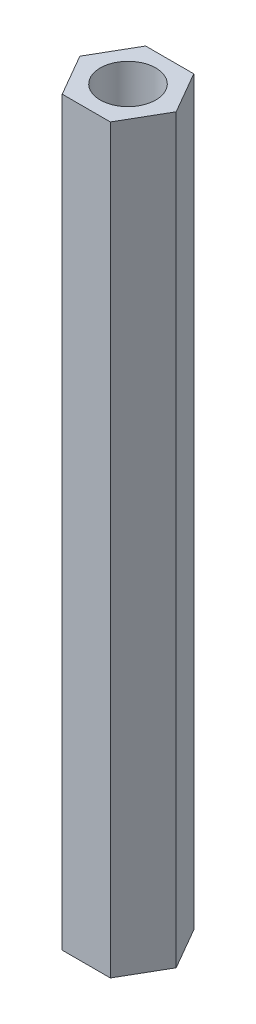
ISO-10303-21;
HEADER;
FILE_DESCRIPTION(('STEP AP214'),'2;1');
FILE_NAME('part.step','',(''),(''),'','','');
FILE_SCHEMA(('AUTOMOTIVE_DESIGN { 1 0 10303 214 1 1 1 1 }'));
ENDSEC;
DATA;
#1=APPLICATION_CONTEXT('core data for automotive mechanical design processes');
#2=APPLICATION_PROTOCOL_DEFINITION('international standard','automotive_design',2000,#1);
#3=PRODUCT_CONTEXT('',#1,'mechanical');
#4=PRODUCT('Part','Part','',(#3));
#5=PRODUCT_RELATED_PRODUCT_CATEGORY('part','',(#4));
#6=PRODUCT_DEFINITION_FORMATION('','',#4);
#7=PRODUCT_DEFINITION_CONTEXT('part definition',#1,'design');
#8=PRODUCT_DEFINITION('design','',#6,#7);
#9=PRODUCT_DEFINITION_SHAPE('','',#8);
#10=(LENGTH_UNIT() NAMED_UNIT(*) SI_UNIT(.MILLI.,.METRE.));
#11=(NAMED_UNIT(*) PLANE_ANGLE_UNIT() SI_UNIT($,.RADIAN.));
#12=(NAMED_UNIT(*) SI_UNIT($,.STERADIAN.) SOLID_ANGLE_UNIT());
#13=UNCERTAINTY_MEASURE_WITH_UNIT(LENGTH_MEASURE(1.E-05),#10,'distance_accuracy_value','');
#14=(GEOMETRIC_REPRESENTATION_CONTEXT(3) GLOBAL_UNCERTAINTY_ASSIGNED_CONTEXT((#13)) GLOBAL_UNIT_ASSIGNED_CONTEXT((#10,
#11,#12)) REPRESENTATION_CONTEXT('',''));
#15=CARTESIAN_POINT('',(0.,0.,0.));
#16=DIRECTION('',(0.,0.,1.));
#17=DIRECTION('',(1.,0.,0.));
#18=AXIS2_PLACEMENT_3D('',#15,#16,#17);
#19=CARTESIAN_POINT('',(0.,40.,0.));
#20=DIRECTION('',(0.,1.,0.));
#21=DIRECTION('',(0.,0.,1.));
#22=AXIS2_PLACEMENT_3D('',#19,#20,#21);
#23=PLANE('',#22);
#24=DIRECTION('',(0.499999999999995,0.,-0.866025403784441));
#25=VECTOR('',#24,1.);
#26=CARTESIAN_POINT('',(1.29903810567669,40.,2.24999999999999));
#27=LINE('',#26,#25);
#28=CARTESIAN_POINT('',(1.29903810567669,40.,2.24999999999999));
#29=VERTEX_POINT('',#28);
#30=CARTESIAN_POINT('',(2.59807621135332,40.,0.));
#31=VERTEX_POINT('',#30);
#32=EDGE_CURVE('E146',#29,#31,#27,.T.);
#33=ORIENTED_EDGE('',*,*,#32,.T.);
#34=DIRECTION('',(-0.500000000000001,0.,-0.866025403784438));
#35=VECTOR('',#34,1.);
#36=CARTESIAN_POINT('',(2.59807621135332,40.,0.));
#37=LINE('',#36,#35);
#38=CARTESIAN_POINT('',(1.29903810567665,40.,-2.25));
#39=VERTEX_POINT('',#38);
#40=EDGE_CURVE('E94',#31,#39,#37,.T.);
#41=ORIENTED_EDGE('',*,*,#40,.T.);
#42=DIRECTION('',(-1.,0.,0.));
#43=VECTOR('',#42,1.);
#44=CARTESIAN_POINT('',(1.29903810567665,40.,-2.25));
#45=LINE('',#44,#43);
#46=CARTESIAN_POINT('',(-1.29903810567667,40.,-2.25));
#47=VERTEX_POINT('',#46);
#48=EDGE_CURVE('E107',#39,#47,#45,.T.);
#49=ORIENTED_EDGE('',*,*,#48,.T.);
#50=DIRECTION('',(-0.499999999999995,0.,0.866025403784442));
#51=VECTOR('',#50,1.);
#52=CARTESIAN_POINT('',(-1.29903810567667,40.,-2.25));
#53=LINE('',#52,#51);
#54=CARTESIAN_POINT('',(-2.59807621135332,40.,0.));
#55=VERTEX_POINT('',#54);
#56=EDGE_CURVE('E101',#47,#55,#53,.T.);
#57=ORIENTED_EDGE('',*,*,#56,.T.);
#58=DIRECTION('',(0.500000000000007,0.,0.866025403784435));
#59=VECTOR('',#58,1.);
#60=CARTESIAN_POINT('',(-2.59807621135332,40.,0.));
#61=LINE('',#60,#59);
#62=CARTESIAN_POINT('',(-1.29903810567664,40.,2.25000000000001));
#63=VERTEX_POINT('',#62);
#64=EDGE_CURVE('E105',#55,#63,#61,.T.);
#65=ORIENTED_EDGE('',*,*,#64,.T.);
#66=DIRECTION('',(1.,0.,0.));
#67=VECTOR('',#66,1.);
#68=CARTESIAN_POINT('',(-1.29903810567664,40.,2.25000000000001));
#69=LINE('',#68,#67);
#70=EDGE_CURVE('E57',#63,#29,#69,.T.);
#71=ORIENTED_EDGE('',*,*,#70,.T.);
#72=EDGE_LOOP('',(#33,#41,#49,#57,#65,#71));
#73=FACE_BOUND('',#72,.T.);
#74=CARTESIAN_POINT('',(0.,40.,0.));
#75=DIRECTION('',(0.,1.,0.));
#76=DIRECTION('',(0.,0.,1.));
#77=AXIS2_PLACEMENT_3D('',#74,#75,#76);
#78=CIRCLE('',#77,1.5);
#79=CARTESIAN_POINT('',(0.,40.,1.5));
#80=VERTEX_POINT('',#79);
#81=EDGE_CURVE('E134',#80,#80,#78,.T.);
#82=ORIENTED_EDGE('',*,*,#81,.F.);
#83=EDGE_LOOP('',(#82));
#84=FACE_BOUND('',#83,.T.);
#85=ADVANCED_FACE('F39',(#73,#84),#23,.T.);
#86=CARTESIAN_POINT('',(0.,0.,0.));
#87=DIRECTION('',(0.,1.,0.));
#88=DIRECTION('',(0.,0.,1.));
#89=AXIS2_PLACEMENT_3D('',#86,#87,#88);
#90=PLANE('',#89);
#91=DIRECTION('',(0.499999999999995,0.,-0.866025403784441));
#92=VECTOR('',#91,1.);
#93=CARTESIAN_POINT('',(1.29903810567669,0.,2.24999999999999));
#94=LINE('',#93,#92);
#95=CARTESIAN_POINT('',(1.29903810567669,0.,2.24999999999999));
#96=VERTEX_POINT('',#95);
#97=CARTESIAN_POINT('',(2.59807621135332,0.,0.));
#98=VERTEX_POINT('',#97);
#99=EDGE_CURVE('E129',#96,#98,#94,.T.);
#100=ORIENTED_EDGE('',*,*,#99,.F.);
#101=DIRECTION('',(1.,0.,0.));
#102=VECTOR('',#101,1.);
#103=CARTESIAN_POINT('',(-1.29903810567664,0.,2.25000000000001));
#104=LINE('',#103,#102);
#105=CARTESIAN_POINT('',(-1.29903810567664,0.,2.25000000000001));
#106=VERTEX_POINT('',#105);
#107=EDGE_CURVE('E86',#106,#96,#104,.T.);
#108=ORIENTED_EDGE('',*,*,#107,.F.);
#109=DIRECTION('',(0.500000000000007,0.,0.866025403784435));
#110=VECTOR('',#109,1.);
#111=CARTESIAN_POINT('',(-2.59807621135332,0.,0.));
#112=LINE('',#111,#110);
#113=CARTESIAN_POINT('',(-2.59807621135332,0.,0.));
#114=VERTEX_POINT('',#113);
#115=EDGE_CURVE('E80',#114,#106,#112,.T.);
#116=ORIENTED_EDGE('',*,*,#115,.F.);
#117=DIRECTION('',(-0.499999999999995,0.,0.866025403784442));
#118=VECTOR('',#117,1.);
#119=CARTESIAN_POINT('',(-1.29903810567667,0.,-2.25));
#120=LINE('',#119,#118);
#121=CARTESIAN_POINT('',(-1.29903810567667,0.,-2.25));
#122=VERTEX_POINT('',#121);
#123=EDGE_CURVE('E116',#122,#114,#120,.T.);
#124=ORIENTED_EDGE('',*,*,#123,.F.);
#125=DIRECTION('',(-1.,0.,0.));
#126=VECTOR('',#125,1.);
#127=CARTESIAN_POINT('',(1.29903810567665,0.,-2.25));
#128=LINE('',#127,#126);
#129=CARTESIAN_POINT('',(1.29903810567665,0.,-2.25));
#130=VERTEX_POINT('',#129);
#131=EDGE_CURVE('E137',#130,#122,#128,.T.);
#132=ORIENTED_EDGE('',*,*,#131,.F.);
#133=DIRECTION('',(-0.500000000000001,0.,-0.866025403784438));
#134=VECTOR('',#133,1.);
#135=CARTESIAN_POINT('',(2.59807621135332,0.,0.));
#136=LINE('',#135,#134);
#137=EDGE_CURVE('E133',#98,#130,#136,.T.);
#138=ORIENTED_EDGE('',*,*,#137,.F.);
#139=EDGE_LOOP('',(#100,#108,#116,#124,#132,#138));
#140=FACE_BOUND('',#139,.T.);
#141=CARTESIAN_POINT('',(0.,0.,0.));
#142=DIRECTION('',(0.,1.,0.));
#143=DIRECTION('',(0.,0.,1.));
#144=AXIS2_PLACEMENT_3D('',#141,#142,#143);
#145=CIRCLE('',#144,1.5);
#146=CARTESIAN_POINT('',(0.,0.,1.5));
#147=VERTEX_POINT('',#146);
#148=EDGE_CURVE('E243',#147,#147,#145,.T.);
#149=ORIENTED_EDGE('',*,*,#148,.T.);
#150=EDGE_LOOP('',(#149));
#151=FACE_BOUND('',#150,.T.);
#152=ADVANCED_FACE('F159',(#140,#151),#90,.F.);
#153=CARTESIAN_POINT('',(1.29903810567669,40.,2.24999999999999));
#154=DIRECTION('',(-0.866025403784442,0.,-0.499999999999995));
#155=DIRECTION('',(-0.499999999999995,0.,0.866025403784442));
#156=AXIS2_PLACEMENT_3D('',#153,#154,#155);
#157=PLANE('',#156);
#158=ORIENTED_EDGE('',*,*,#99,.T.);
#159=DIRECTION('',(0.,-1.,0.));
#160=VECTOR('',#159,1.);
#161=CARTESIAN_POINT('',(2.59807621135332,40.,0.));
#162=LINE('',#161,#160);
#163=EDGE_CURVE('E11',#31,#98,#162,.T.);
#164=ORIENTED_EDGE('',*,*,#163,.F.);
#165=ORIENTED_EDGE('',*,*,#32,.F.);
#166=DIRECTION('',(0.,-1.,0.));
#167=VECTOR('',#166,1.);
#168=CARTESIAN_POINT('',(1.29903810567669,40.,2.24999999999999));
#169=LINE('',#168,#167);
#170=EDGE_CURVE('E125',#29,#96,#169,.T.);
#171=ORIENTED_EDGE('',*,*,#170,.T.);
#172=EDGE_LOOP('',(#158,#164,#165,#171));
#173=FACE_BOUND('',#172,.T.);
#174=ADVANCED_FACE('F41',(#173),#157,.F.);
#175=CARTESIAN_POINT('',(2.59807621135332,40.,0.));
#176=DIRECTION('',(-0.866025403784438,0.,0.500000000000001));
#177=DIRECTION('',(0.500000000000001,0.,0.866025403784438));
#178=AXIS2_PLACEMENT_3D('',#175,#176,#177);
#179=PLANE('',#178);
#180=ORIENTED_EDGE('',*,*,#137,.T.);
#181=DIRECTION('',(0.,-1.,0.));
#182=VECTOR('',#181,1.);
#183=CARTESIAN_POINT('',(1.29903810567665,40.,-2.25));
#184=LINE('',#183,#182);
#185=EDGE_CURVE('E49',#39,#130,#184,.T.);
#186=ORIENTED_EDGE('',*,*,#185,.F.);
#187=ORIENTED_EDGE('',*,*,#40,.F.);
#188=ORIENTED_EDGE('',*,*,#163,.T.);
#189=EDGE_LOOP('',(#180,#186,#187,#188));
#190=FACE_BOUND('',#189,.T.);
#191=ADVANCED_FACE('F184',(#190),#179,.F.);
#192=CARTESIAN_POINT('',(1.29903810567665,40.,-2.25));
#193=DIRECTION('',(0.,0.,1.));
#194=DIRECTION('',(1.,0.,0.));
#195=AXIS2_PLACEMENT_3D('',#192,#193,#194);
#196=PLANE('',#195);
#197=ORIENTED_EDGE('',*,*,#131,.T.);
#198=DIRECTION('',(0.,-1.,0.));
#199=VECTOR('',#198,1.);
#200=CARTESIAN_POINT('',(-1.29903810567667,40.,-2.25));
#201=LINE('',#200,#199);
#202=EDGE_CURVE('E118',#47,#122,#201,.T.);
#203=ORIENTED_EDGE('',*,*,#202,.F.);
#204=ORIENTED_EDGE('',*,*,#48,.F.);
#205=ORIENTED_EDGE('',*,*,#185,.T.);
#206=EDGE_LOOP('',(#197,#203,#204,#205));
#207=FACE_BOUND('',#206,.T.);
#208=ADVANCED_FACE('F156',(#207),#196,.F.);
#209=CARTESIAN_POINT('',(-1.29903810567667,40.,-2.25));
#210=DIRECTION('',(0.866025403784442,0.,0.499999999999995));
#211=DIRECTION('',(0.499999999999995,0.,-0.866025403784442));
#212=AXIS2_PLACEMENT_3D('',#209,#210,#211);
#213=PLANE('',#212);
#214=ORIENTED_EDGE('',*,*,#123,.T.);
#215=DIRECTION('',(0.,-1.,0.));
#216=VECTOR('',#215,1.);
#217=CARTESIAN_POINT('',(-2.59807621135332,40.,0.));
#218=LINE('',#217,#216);
#219=EDGE_CURVE('E113',#55,#114,#218,.T.);
#220=ORIENTED_EDGE('',*,*,#219,.F.);
#221=ORIENTED_EDGE('',*,*,#56,.F.);
#222=ORIENTED_EDGE('',*,*,#202,.T.);
#223=EDGE_LOOP('',(#214,#220,#221,#222));
#224=FACE_BOUND('',#223,.T.);
#225=ADVANCED_FACE('F114',(#224),#213,.F.);
#226=CARTESIAN_POINT('',(-2.59807621135332,40.,0.));
#227=DIRECTION('',(0.866025403784434,0.,-0.500000000000007));
#228=DIRECTION('',(-0.500000000000007,0.,-0.866025403784435));
#229=AXIS2_PLACEMENT_3D('',#226,#227,#228);
#230=PLANE('',#229);
#231=ORIENTED_EDGE('',*,*,#115,.T.);
#232=DIRECTION('',(0.,-1.,0.));
#233=VECTOR('',#232,1.);
#234=CARTESIAN_POINT('',(-1.29903810567664,40.,2.25000000000001));
#235=LINE('',#234,#233);
#236=EDGE_CURVE('E119',#63,#106,#235,.T.);
#237=ORIENTED_EDGE('',*,*,#236,.F.);
#238=ORIENTED_EDGE('',*,*,#64,.F.);
#239=ORIENTED_EDGE('',*,*,#219,.T.);
#240=EDGE_LOOP('',(#231,#237,#238,#239));
#241=FACE_BOUND('',#240,.T.);
#242=ADVANCED_FACE('F121',(#241),#230,.F.);
#243=CARTESIAN_POINT('',(-1.29903810567664,40.,2.25000000000001));
#244=DIRECTION('',(0.,0.,-1.));
#245=DIRECTION('',(-1.,0.,0.));
#246=AXIS2_PLACEMENT_3D('',#243,#244,#245);
#247=PLANE('',#246);
#248=ORIENTED_EDGE('',*,*,#107,.T.);
#249=ORIENTED_EDGE('',*,*,#170,.F.);
#250=ORIENTED_EDGE('',*,*,#70,.F.);
#251=ORIENTED_EDGE('',*,*,#236,.T.);
#252=EDGE_LOOP('',(#248,#249,#250,#251));
#253=FACE_BOUND('',#252,.T.);
#254=ADVANCED_FACE('F164',(#253),#247,.F.);
#255=CARTESIAN_POINT('',(0.,40.,0.));
#256=DIRECTION('',(0.,-1.,0.));
#257=DIRECTION('',(0.,0.,-1.));
#258=AXIS2_PLACEMENT_3D('',#255,#256,#257);
#259=CYLINDRICAL_SURFACE('',#258,1.5);
#260=ORIENTED_EDGE('',*,*,#81,.T.);
#261=EDGE_LOOP('',(#260));
#262=FACE_BOUND('',#261,.T.);
#263=ORIENTED_EDGE('',*,*,#148,.F.);
#264=EDGE_LOOP('',(#263));
#265=FACE_BOUND('',#264,.T.);
#266=ADVANCED_FACE('F166',(#262,#265),#259,.F.);
#267=CLOSED_SHELL('',(#85,#152,#174,#191,#208,#225,#242,#254,#266));
#268=MANIFOLD_SOLID_BREP('B2',#267);
#269=ADVANCED_BREP_SHAPE_REPRESENTATION('',(#18,#268),#14);
#270=SHAPE_DEFINITION_REPRESENTATION(#9,#269);
ENDSEC;
END-ISO-10303-21;
